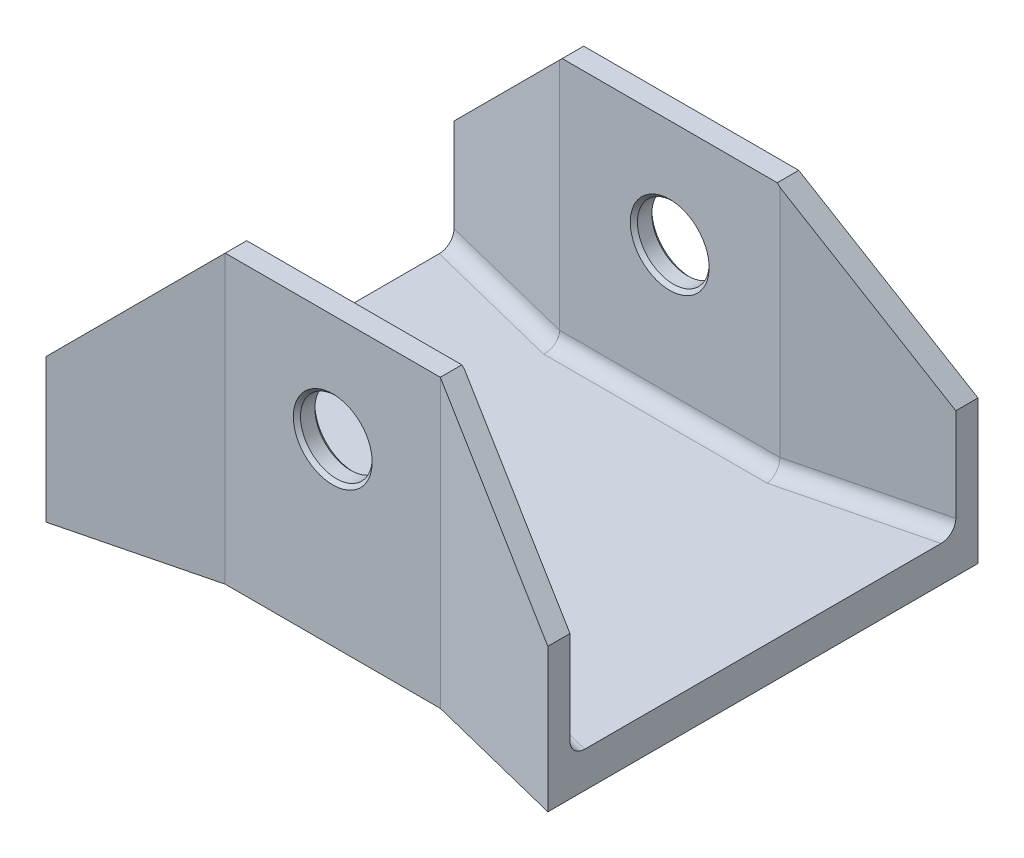
ISO-10303-21;
HEADER;
FILE_DESCRIPTION(('STEP AP214'),'2;1');
FILE_NAME('part.step','',(''),(''),'','','');
FILE_SCHEMA(('AUTOMOTIVE_DESIGN { 1 0 10303 214 1 1 1 1 }'));
ENDSEC;
DATA;
#1=APPLICATION_CONTEXT('core data for automotive mechanical design processes');
#2=APPLICATION_PROTOCOL_DEFINITION('international standard','automotive_design',2000,#1);
#3=PRODUCT_CONTEXT('',#1,'mechanical');
#4=PRODUCT('Part','Part','',(#3));
#5=PRODUCT_RELATED_PRODUCT_CATEGORY('part','',(#4));
#6=PRODUCT_DEFINITION_FORMATION('','',#4);
#7=PRODUCT_DEFINITION_CONTEXT('part definition',#1,'design');
#8=PRODUCT_DEFINITION('design','',#6,#7);
#9=PRODUCT_DEFINITION_SHAPE('','',#8);
#10=(LENGTH_UNIT() NAMED_UNIT(*) SI_UNIT(.MILLI.,.METRE.));
#11=(NAMED_UNIT(*) PLANE_ANGLE_UNIT() SI_UNIT($,.RADIAN.));
#12=(NAMED_UNIT(*) SI_UNIT($,.STERADIAN.) SOLID_ANGLE_UNIT());
#13=UNCERTAINTY_MEASURE_WITH_UNIT(LENGTH_MEASURE(1.E-05),#10,'distance_accuracy_value','');
#14=(GEOMETRIC_REPRESENTATION_CONTEXT(3) GLOBAL_UNCERTAINTY_ASSIGNED_CONTEXT((#13)) GLOBAL_UNIT_ASSIGNED_CONTEXT((#10,
#11,#12)) REPRESENTATION_CONTEXT('',''));
#15=CARTESIAN_POINT('',(0.,0.,0.));
#16=DIRECTION('',(0.,0.,1.));
#17=DIRECTION('',(1.,0.,0.));
#18=AXIS2_PLACEMENT_3D('',#15,#16,#17);
#19=CARTESIAN_POINT('',(0.,40.,0.));
#20=DIRECTION('',(0.,1.,0.));
#21=DIRECTION('',(0.,0.,1.));
#22=AXIS2_PLACEMENT_3D('',#19,#20,#21);
#23=PLANE('',#22);
#24=DIRECTION('',(1.,0.,0.));
#25=VECTOR('',#24,1.);
#26=CARTESIAN_POINT('',(-15.,40.,25.));
#27=LINE('',#26,#25);
#28=CARTESIAN_POINT('',(-15.,40.,25.));
#29=VERTEX_POINT('',#28);
#30=CARTESIAN_POINT('',(14.9999999999998,40.,25.));
#31=VERTEX_POINT('',#30);
#32=EDGE_CURVE('E216',#29,#31,#27,.T.);
#33=ORIENTED_EDGE('',*,*,#32,.T.);
#34=DIRECTION('',(0.,0.,-1.));
#35=VECTOR('',#34,1.);
#36=CARTESIAN_POINT('',(14.9999999999995,40.,26.907670780787));
#37=LINE('',#36,#35);
#38=CARTESIAN_POINT('',(14.9999999999995,40.,22.));
#39=VERTEX_POINT('',#38);
#40=EDGE_CURVE('E221',#31,#39,#37,.T.);
#41=ORIENTED_EDGE('',*,*,#40,.T.);
#42=DIRECTION('',(1.,0.,0.));
#43=VECTOR('',#42,1.);
#44=CARTESIAN_POINT('',(-15.369316876853,40.,22.));
#45=LINE('',#44,#43);
#46=CARTESIAN_POINT('',(-14.9999999999997,40.,22.));
#47=VERTEX_POINT('',#46);
#48=EDGE_CURVE('E219',#47,#39,#45,.T.);
#49=ORIENTED_EDGE('',*,*,#48,.F.);
#50=DIRECTION('',(0.,0.,1.));
#51=VECTOR('',#50,1.);
#52=CARTESIAN_POINT('',(-14.9999999999997,40.,30.));
#53=LINE('',#52,#51);
#54=EDGE_CURVE('E202',#47,#29,#53,.T.);
#55=ORIENTED_EDGE('',*,*,#54,.T.);
#56=EDGE_LOOP('',(#33,#41,#49,#55));
#57=FACE_BOUND('',#56,.T.);
#58=ADVANCED_FACE('F45',(#57),#23,.T.);
#59=CARTESIAN_POINT('',(-35.,40.,-30.));
#60=DIRECTION('',(-0.242535625036333,0.,0.970142500145332));
#61=DIRECTION('',(0.970142500145332,0.,0.242535625036333));
#62=AXIS2_PLACEMENT_3D('',#59,#60,#61);
#63=PLANE('',#62);
#64=DIRECTION('',(0.,-1.,0.));
#65=VECTOR('',#64,1.);
#66=CARTESIAN_POINT('',(-35.,40.,-30.));
#67=LINE('',#66,#65);
#68=CARTESIAN_POINT('',(-35.,19.9999999999999,-30.));
#69=VERTEX_POINT('',#68);
#70=CARTESIAN_POINT('',(-35.,0.,-30.));
#71=VERTEX_POINT('',#70);
#72=EDGE_CURVE('E293',#69,#71,#67,.T.);
#73=ORIENTED_EDGE('',*,*,#72,.F.);
#74=DIRECTION('',(0.696310623822795,0.696310623822788,0.174077655955698));
#75=VECTOR('',#74,1.);
#76=CARTESIAN_POINT('',(-11.9696969696966,43.030303030303,-24.2424242424242));
#77=LINE('',#76,#75);
#78=CARTESIAN_POINT('',(-15.,40.,-25.));
#79=VERTEX_POINT('',#78);
#80=EDGE_CURVE('E209',#69,#79,#77,.T.);
#81=ORIENTED_EDGE('',*,*,#80,.T.);
#82=DIRECTION('',(0.,-1.,0.));
#83=VECTOR('',#82,1.);
#84=CARTESIAN_POINT('',(-15.,40.,-25.));
#85=LINE('',#84,#83);
#86=CARTESIAN_POINT('',(-15.,0.,-25.));
#87=VERTEX_POINT('',#86);
#88=EDGE_CURVE('E245',#79,#87,#85,.T.);
#89=ORIENTED_EDGE('',*,*,#88,.T.);
#90=DIRECTION('',(-0.970142500145332,0.,-0.242535625036332));
#91=VECTOR('',#90,1.);
#92=CARTESIAN_POINT('',(-35.,0.,-30.));
#93=LINE('',#92,#91);
#94=EDGE_CURVE('E253',#87,#71,#93,.T.);
#95=ORIENTED_EDGE('',*,*,#94,.T.);
#96=EDGE_LOOP('',(#73,#81,#89,#95));
#97=FACE_BOUND('',#96,.T.);
#98=ADVANCED_FACE('F579',(#97),#63,.F.);
#99=CARTESIAN_POINT('',(-35.,40.,30.));
#100=DIRECTION('',(1.,0.,0.));
#101=DIRECTION('',(0.,0.,-1.));
#102=AXIS2_PLACEMENT_3D('',#99,#100,#101);
#103=PLANE('',#102);
#104=DIRECTION('',(0.,0.,1.));
#105=VECTOR('',#104,1.);
#106=CARTESIAN_POINT('',(-35.,5.,30.));
#107=LINE('',#106,#105);
#108=CARTESIAN_POINT('',(-35.,5.,-24.8461179679779));
#109=VERTEX_POINT('',#108);
#110=CARTESIAN_POINT('',(-35.,5.,24.8461179679779));
#111=VERTEX_POINT('',#110);
#112=EDGE_CURVE('E250',#109,#111,#107,.T.);
#113=ORIENTED_EDGE('',*,*,#112,.F.);
#114=CARTESIAN_POINT('',(-35.,7.,-24.8461179679779));
#115=DIRECTION('',(1.,0.,0.));
#116=DIRECTION('',(0.,0.,-1.));
#117=AXIS2_PLACEMENT_3D('',#114,#115,#116);
#118=ELLIPSE('',#117,2.06155281280883,2.);
#119=CARTESIAN_POINT('',(-35.,7.,-26.9076707807868));
#120=VERTEX_POINT('',#119);
#121=EDGE_CURVE('E62',#109,#120,#118,.T.);
#122=ORIENTED_EDGE('',*,*,#121,.T.);
#123=DIRECTION('',(0.,1.,0.));
#124=VECTOR('',#123,1.);
#125=CARTESIAN_POINT('',(-35.,40.,-26.9076707807868));
#126=LINE('',#125,#124);
#127=CARTESIAN_POINT('',(-35.,19.9999999999999,-26.9076707807868));
#128=VERTEX_POINT('',#127);
#129=EDGE_CURVE('E496',#120,#128,#126,.T.);
#130=ORIENTED_EDGE('',*,*,#129,.T.);
#131=DIRECTION('',(0.,0.,-1.));
#132=VECTOR('',#131,1.);
#133=CARTESIAN_POINT('',(-35.,19.9999999999999,-30.));
#134=LINE('',#133,#132);
#135=EDGE_CURVE('E349',#128,#69,#134,.T.);
#136=ORIENTED_EDGE('',*,*,#135,.T.);
#137=ORIENTED_EDGE('',*,*,#72,.T.);
#138=DIRECTION('',(0.,0.,1.));
#139=VECTOR('',#138,1.);
#140=CARTESIAN_POINT('',(-35.,0.,30.));
#141=LINE('',#140,#139);
#142=CARTESIAN_POINT('',(-35.,0.,30.));
#143=VERTEX_POINT('',#142);
#144=EDGE_CURVE('E257',#71,#143,#141,.T.);
#145=ORIENTED_EDGE('',*,*,#144,.T.);
#146=DIRECTION('',(0.,-1.,0.));
#147=VECTOR('',#146,1.);
#148=CARTESIAN_POINT('',(-35.,40.,30.));
#149=LINE('',#148,#147);
#150=CARTESIAN_POINT('',(-35.,19.9999999999999,30.));
#151=VERTEX_POINT('',#150);
#152=EDGE_CURVE('E232',#151,#143,#149,.T.);
#153=ORIENTED_EDGE('',*,*,#152,.F.);
#154=DIRECTION('',(0.,0.,-1.));
#155=VECTOR('',#154,1.);
#156=CARTESIAN_POINT('',(-35.,19.9999999999999,26.9076707807868));
#157=LINE('',#156,#155);
#158=CARTESIAN_POINT('',(-35.,19.9999999999999,26.9076707807868));
#159=VERTEX_POINT('',#158);
#160=EDGE_CURVE('E203',#151,#159,#157,.T.);
#161=ORIENTED_EDGE('',*,*,#160,.T.);
#162=DIRECTION('',(0.,-1.,0.));
#163=VECTOR('',#162,1.);
#164=CARTESIAN_POINT('',(-35.,40.,26.9076707807868));
#165=LINE('',#164,#163);
#166=CARTESIAN_POINT('',(-35.,7.,26.9076707807868));
#167=VERTEX_POINT('',#166);
#168=EDGE_CURVE('E491',#159,#167,#165,.T.);
#169=ORIENTED_EDGE('',*,*,#168,.T.);
#170=CARTESIAN_POINT('',(-35.,7.,24.8461179679779));
#171=DIRECTION('',(1.,0.,0.));
#172=DIRECTION('',(0.,0.,-1.));
#173=AXIS2_PLACEMENT_3D('',#170,#171,#172);
#174=ELLIPSE('',#173,2.06155281280883,2.);
#175=EDGE_CURVE('E394',#167,#111,#174,.T.);
#176=ORIENTED_EDGE('',*,*,#175,.T.);
#177=EDGE_LOOP('',(#113,#122,#130,#136,#137,#145,#153,#161,#169,#176));
#178=FACE_BOUND('',#177,.T.);
#179=ADVANCED_FACE('F492',(#178),#103,.F.);
#180=CARTESIAN_POINT('',(-35.,40.,30.));
#181=DIRECTION('',(-0.242535625036333,0.,-0.970142500145332));
#182=DIRECTION('',(-0.970142500145332,0.,0.242535625036333));
#183=AXIS2_PLACEMENT_3D('',#180,#181,#182);
#184=PLANE('',#183);
#185=DIRECTION('',(0.,-1.,0.));
#186=VECTOR('',#185,1.);
#187=CARTESIAN_POINT('',(-15.,40.,25.));
#188=LINE('',#187,#186);
#189=CARTESIAN_POINT('',(-15.,0.,25.));
#190=VERTEX_POINT('',#189);
#191=EDGE_CURVE('E225',#29,#190,#188,.T.);
#192=ORIENTED_EDGE('',*,*,#191,.F.);
#193=DIRECTION('',(-0.696310623822795,-0.696310623822788,0.174077655955698));
#194=VECTOR('',#193,1.);
#195=CARTESIAN_POINT('',(-11.9696969696966,43.030303030303,24.2424242424242));
#196=LINE('',#195,#194);
#197=EDGE_CURVE('E197',#29,#151,#196,.T.);
#198=ORIENTED_EDGE('',*,*,#197,.T.);
#199=ORIENTED_EDGE('',*,*,#152,.T.);
#200=DIRECTION('',(0.970142500145332,0.,-0.242535625036332));
#201=VECTOR('',#200,1.);
#202=CARTESIAN_POINT('',(-35.,0.,30.));
#203=LINE('',#202,#201);
#204=EDGE_CURVE('E228',#143,#190,#203,.T.);
#205=ORIENTED_EDGE('',*,*,#204,.T.);
#206=EDGE_LOOP('',(#192,#198,#199,#205));
#207=FACE_BOUND('',#206,.T.);
#208=ADVANCED_FACE('F226',(#207),#184,.F.);
#209=CARTESIAN_POINT('',(-15.,40.,25.));
#210=DIRECTION('',(0.,0.,-1.));
#211=DIRECTION('',(-1.,0.,0.));
#212=AXIS2_PLACEMENT_3D('',#209,#210,#211);
#213=PLANE('',#212);
#214=CARTESIAN_POINT('',(0.,25.,25.));
#215=DIRECTION('',(0.,0.,-1.));
#216=DIRECTION('',(-1.,0.,0.));
#217=AXIS2_PLACEMENT_3D('',#214,#215,#216);
#218=CIRCLE('',#217,5.50000000000002);
#219=CARTESIAN_POINT('',(-5.50000000000002,25.,25.));
#220=VERTEX_POINT('',#219);
#221=EDGE_CURVE('E11',#220,#220,#218,.T.);
#222=ORIENTED_EDGE('',*,*,#221,.T.);
#223=EDGE_LOOP('',(#222));
#224=FACE_BOUND('',#223,.T.);
#225=DIRECTION('',(1.,0.,0.));
#226=VECTOR('',#225,1.);
#227=CARTESIAN_POINT('',(-15.,0.,25.));
#228=LINE('',#227,#226);
#229=CARTESIAN_POINT('',(14.9999999999998,0.,25.));
#230=VERTEX_POINT('',#229);
#231=EDGE_CURVE('E263',#190,#230,#228,.T.);
#232=ORIENTED_EDGE('',*,*,#231,.T.);
#233=DIRECTION('',(0.,-1.,0.));
#234=VECTOR('',#233,1.);
#235=CARTESIAN_POINT('',(14.9999999999998,40.,25.));
#236=LINE('',#235,#234);
#237=EDGE_CURVE('E233',#31,#230,#236,.T.);
#238=ORIENTED_EDGE('',*,*,#237,.F.);
#239=ORIENTED_EDGE('',*,*,#32,.F.);
#240=ORIENTED_EDGE('',*,*,#191,.T.);
#241=EDGE_LOOP('',(#232,#238,#239,#240));
#242=FACE_BOUND('',#241,.T.);
#243=ADVANCED_FACE('F235',(#224,#242),#213,.F.);
#244=CARTESIAN_POINT('',(34.9999999999998,40.,30.0000000000002));
#245=DIRECTION('',(0.242535625036343,0.,-0.970142500145329));
#246=DIRECTION('',(-0.97014250014533,0.,-0.242535625036343));
#247=AXIS2_PLACEMENT_3D('',#244,#245,#246);
#248=PLANE('',#247);
#249=DIRECTION('',(0.,-1.,0.));
#250=VECTOR('',#249,1.);
#251=CARTESIAN_POINT('',(34.9999999999998,40.,30.0000000000002));
#252=LINE('',#251,#250);
#253=CARTESIAN_POINT('',(34.9999999999998,19.9999999999999,30.0000000000002));
#254=VERTEX_POINT('',#253);
#255=CARTESIAN_POINT('',(34.9999999999998,0.,30.0000000000002));
#256=VERTEX_POINT('',#255);
#257=EDGE_CURVE('E286',#254,#256,#252,.T.);
#258=ORIENTED_EDGE('',*,*,#257,.F.);
#259=DIRECTION('',(-0.696310623822794,0.696310623822787,-0.174077655955706));
#260=VECTOR('',#259,1.);
#261=CARTESIAN_POINT('',(11.9696969696963,43.0303030303031,24.2424242424241));
#262=LINE('',#261,#260);
#263=EDGE_CURVE('E318',#254,#31,#262,.T.);
#264=ORIENTED_EDGE('',*,*,#263,.T.);
#265=ORIENTED_EDGE('',*,*,#237,.T.);
#266=DIRECTION('',(0.970142500145329,0.,0.242535625036343));
#267=VECTOR('',#266,1.);
#268=CARTESIAN_POINT('',(34.9999999999998,0.,30.0000000000002));
#269=LINE('',#268,#267);
#270=EDGE_CURVE('E266',#230,#256,#269,.T.);
#271=ORIENTED_EDGE('',*,*,#270,.T.);
#272=EDGE_LOOP('',(#258,#264,#265,#271));
#273=FACE_BOUND('',#272,.T.);
#274=ADVANCED_FACE('F543',(#273),#248,.F.);
#275=CARTESIAN_POINT('',(34.9999999999998,40.,30.0000000000002));
#276=DIRECTION('',(-1.,0.,0.));
#277=DIRECTION('',(0.,0.,1.));
#278=AXIS2_PLACEMENT_3D('',#275,#276,#277);
#279=PLANE('',#278);
#280=DIRECTION('',(0.,0.,-1.));
#281=VECTOR('',#280,1.);
#282=CARTESIAN_POINT('',(34.9999999999998,5.,30.0000000000002));
#283=LINE('',#282,#281);
#284=CARTESIAN_POINT('',(34.9999999999998,5.,24.8461179679781));
#285=VERTEX_POINT('',#284);
#286=CARTESIAN_POINT('',(34.9999999999998,5.,-24.8461179679781));
#287=VERTEX_POINT('',#286);
#288=EDGE_CURVE('E222',#285,#287,#283,.T.);
#289=ORIENTED_EDGE('',*,*,#288,.F.);
#290=CARTESIAN_POINT('',(34.9999999999998,7.,24.8461179679781));
#291=DIRECTION('',(-1.,0.,0.));
#292=DIRECTION('',(0.,0.,1.));
#293=AXIS2_PLACEMENT_3D('',#290,#291,#292);
#294=ELLIPSE('',#293,2.06155281280884,2.);
#295=CARTESIAN_POINT('',(34.9999999999998,7.,26.907670780787));
#296=VERTEX_POINT('',#295);
#297=EDGE_CURVE('E397',#285,#296,#294,.T.);
#298=ORIENTED_EDGE('',*,*,#297,.T.);
#299=DIRECTION('',(0.,1.,0.));
#300=VECTOR('',#299,1.);
#301=CARTESIAN_POINT('',(34.9999999999998,40.,26.907670780787));
#302=LINE('',#301,#300);
#303=CARTESIAN_POINT('',(34.9999999999998,19.9999999999999,26.907670780787));
#304=VERTEX_POINT('',#303);
#305=EDGE_CURVE('E495',#296,#304,#302,.T.);
#306=ORIENTED_EDGE('',*,*,#305,.T.);
#307=DIRECTION('',(0.,0.,1.));
#308=VECTOR('',#307,1.);
#309=CARTESIAN_POINT('',(34.9999999999998,19.9999999999999,30.0000000000002));
#310=LINE('',#309,#308);
#311=EDGE_CURVE('E315',#304,#254,#310,.T.);
#312=ORIENTED_EDGE('',*,*,#311,.T.);
#313=ORIENTED_EDGE('',*,*,#257,.T.);
#314=DIRECTION('',(0.,0.,-1.));
#315=VECTOR('',#314,1.);
#316=CARTESIAN_POINT('',(34.9999999999998,0.,30.0000000000002));
#317=LINE('',#316,#315);
#318=CARTESIAN_POINT('',(34.9999999999998,0.,-30.0000000000002));
#319=VERTEX_POINT('',#318);
#320=EDGE_CURVE('E270',#256,#319,#317,.T.);
#321=ORIENTED_EDGE('',*,*,#320,.T.);
#322=DIRECTION('',(0.,-1.,0.));
#323=VECTOR('',#322,1.);
#324=CARTESIAN_POINT('',(34.9999999999998,40.,-30.0000000000002));
#325=LINE('',#324,#323);
#326=CARTESIAN_POINT('',(34.9999999999998,19.9999999999999,-30.0000000000002));
#327=VERTEX_POINT('',#326);
#328=EDGE_CURVE('E283',#327,#319,#325,.T.);
#329=ORIENTED_EDGE('',*,*,#328,.F.);
#330=DIRECTION('',(0.,0.,1.));
#331=VECTOR('',#330,1.);
#332=CARTESIAN_POINT('',(34.9999999999998,19.9999999999999,-26.907670780787));
#333=LINE('',#332,#331);
#334=CARTESIAN_POINT('',(34.9999999999998,19.9999999999999,-26.907670780787));
#335=VERTEX_POINT('',#334);
#336=EDGE_CURVE('E312',#327,#335,#333,.T.);
#337=ORIENTED_EDGE('',*,*,#336,.T.);
#338=DIRECTION('',(0.,-1.,0.));
#339=VECTOR('',#338,1.);
#340=CARTESIAN_POINT('',(34.9999999999998,40.,-26.907670780787));
#341=LINE('',#340,#339);
#342=CARTESIAN_POINT('',(34.9999999999998,7.,-26.907670780787));
#343=VERTEX_POINT('',#342);
#344=EDGE_CURVE('E500',#335,#343,#341,.T.);
#345=ORIENTED_EDGE('',*,*,#344,.T.);
#346=CARTESIAN_POINT('',(34.9999999999998,7.,-24.8461179679781));
#347=DIRECTION('',(-1.,0.,0.));
#348=DIRECTION('',(0.,0.,1.));
#349=AXIS2_PLACEMENT_3D('',#346,#347,#348);
#350=ELLIPSE('',#349,2.06155281280884,2.);
#351=EDGE_CURVE('E400',#343,#287,#350,.T.);
#352=ORIENTED_EDGE('',*,*,#351,.T.);
#353=EDGE_LOOP('',(#289,#298,#306,#312,#313,#321,#329,#337,#345,#352));
#354=FACE_BOUND('',#353,.T.);
#355=ADVANCED_FACE('F535',(#354),#279,.F.);
#356=CARTESIAN_POINT('',(34.9999999999998,40.,-30.0000000000002));
#357=DIRECTION('',(0.242535625036343,0.,0.970142500145329));
#358=DIRECTION('',(0.97014250014533,0.,-0.242535625036343));
#359=AXIS2_PLACEMENT_3D('',#356,#357,#358);
#360=PLANE('',#359);
#361=DIRECTION('',(0.,-1.,0.));
#362=VECTOR('',#361,1.);
#363=CARTESIAN_POINT('',(14.9999999999998,40.,-25.));
#364=LINE('',#363,#362);
#365=CARTESIAN_POINT('',(14.9999999999998,40.,-25.));
#366=VERTEX_POINT('',#365);
#367=CARTESIAN_POINT('',(14.9999999999998,0.,-25.));
#368=VERTEX_POINT('',#367);
#369=EDGE_CURVE('E279',#366,#368,#364,.T.);
#370=ORIENTED_EDGE('',*,*,#369,.F.);
#371=DIRECTION('',(0.696310623822794,-0.696310623822787,-0.174077655955706));
#372=VECTOR('',#371,1.);
#373=CARTESIAN_POINT('',(11.9696969696963,43.0303030303031,-24.2424242424241));
#374=LINE('',#373,#372);
#375=EDGE_CURVE('E329',#366,#327,#374,.T.);
#376=ORIENTED_EDGE('',*,*,#375,.T.);
#377=ORIENTED_EDGE('',*,*,#328,.T.);
#378=DIRECTION('',(-0.970142500145329,0.,0.242535625036343));
#379=VECTOR('',#378,1.);
#380=CARTESIAN_POINT('',(34.9999999999998,0.,-30.0000000000002));
#381=LINE('',#380,#379);
#382=EDGE_CURVE('E247',#319,#368,#381,.T.);
#383=ORIENTED_EDGE('',*,*,#382,.T.);
#384=EDGE_LOOP('',(#370,#376,#377,#383));
#385=FACE_BOUND('',#384,.T.);
#386=ADVANCED_FACE('F584',(#385),#360,.F.);
#387=CARTESIAN_POINT('',(-15.,40.,-25.));
#388=DIRECTION('',(0.,0.,1.));
#389=DIRECTION('',(1.,0.,0.));
#390=AXIS2_PLACEMENT_3D('',#387,#388,#389);
#391=PLANE('',#390);
#392=CARTESIAN_POINT('',(0.,25.,-25.));
#393=DIRECTION('',(0.,0.,1.));
#394=DIRECTION('',(1.,0.,0.));
#395=AXIS2_PLACEMENT_3D('',#392,#393,#394);
#396=CIRCLE('',#395,5.50000000000001);
#397=CARTESIAN_POINT('',(5.50000000000001,25.,-25.));
#398=VERTEX_POINT('',#397);
#399=EDGE_CURVE('E432',#398,#398,#396,.T.);
#400=ORIENTED_EDGE('',*,*,#399,.T.);
#401=EDGE_LOOP('',(#400));
#402=FACE_BOUND('',#401,.T.);
#403=DIRECTION('',(-1.,0.,0.));
#404=VECTOR('',#403,1.);
#405=CARTESIAN_POINT('',(-15.,0.,-25.));
#406=LINE('',#405,#404);
#407=EDGE_CURVE('E240',#368,#87,#406,.T.);
#408=ORIENTED_EDGE('',*,*,#407,.T.);
#409=ORIENTED_EDGE('',*,*,#88,.F.);
#410=DIRECTION('',(-1.,0.,0.));
#411=VECTOR('',#410,1.);
#412=CARTESIAN_POINT('',(-15.,40.,-25.));
#413=LINE('',#412,#411);
#414=EDGE_CURVE('E239',#366,#79,#413,.T.);
#415=ORIENTED_EDGE('',*,*,#414,.F.);
#416=ORIENTED_EDGE('',*,*,#369,.T.);
#417=EDGE_LOOP('',(#408,#409,#415,#416));
#418=FACE_BOUND('',#417,.T.);
#419=ADVANCED_FACE('F582',(#402,#418),#391,.F.);
#420=DIRECTION('',(-1.,0.,0.));
#421=VECTOR('',#420,1.);
#422=CARTESIAN_POINT('',(15.3693168768528,40.,-22.));
#423=LINE('',#422,#421);
#424=CARTESIAN_POINT('',(14.9999999999995,40.,-22.));
#425=VERTEX_POINT('',#424);
#426=CARTESIAN_POINT('',(-14.9999999999997,40.,-22.));
#427=VERTEX_POINT('',#426);
#428=EDGE_CURVE('E414',#425,#427,#423,.T.);
#429=ORIENTED_EDGE('',*,*,#428,.F.);
#430=DIRECTION('',(0.,0.,-1.));
#431=VECTOR('',#430,1.);
#432=CARTESIAN_POINT('',(14.9999999999995,40.,-30.0000000000002));
#433=LINE('',#432,#431);
#434=EDGE_CURVE('E325',#425,#366,#433,.T.);
#435=ORIENTED_EDGE('',*,*,#434,.T.);
#436=ORIENTED_EDGE('',*,*,#414,.T.);
#437=DIRECTION('',(0.,0.,1.));
#438=VECTOR('',#437,1.);
#439=CARTESIAN_POINT('',(-14.9999999999997,40.,-26.9076707807868));
#440=LINE('',#439,#438);
#441=EDGE_CURVE('E321',#79,#427,#440,.T.);
#442=ORIENTED_EDGE('',*,*,#441,.T.);
#443=EDGE_LOOP('',(#429,#435,#436,#442));
#444=FACE_BOUND('',#443,.T.);
#445=ADVANCED_FACE('F560',(#444),#23,.T.);
#446=CARTESIAN_POINT('',(0.,0.,0.));
#447=DIRECTION('',(0.,1.,0.));
#448=DIRECTION('',(0.,0.,1.));
#449=AXIS2_PLACEMENT_3D('',#446,#447,#448);
#450=PLANE('',#449);
#451=ORIENTED_EDGE('',*,*,#94,.F.);
#452=ORIENTED_EDGE('',*,*,#407,.F.);
#453=ORIENTED_EDGE('',*,*,#382,.F.);
#454=ORIENTED_EDGE('',*,*,#320,.F.);
#455=ORIENTED_EDGE('',*,*,#270,.F.);
#456=ORIENTED_EDGE('',*,*,#231,.F.);
#457=ORIENTED_EDGE('',*,*,#204,.F.);
#458=ORIENTED_EDGE('',*,*,#144,.F.);
#459=EDGE_LOOP('',(#451,#452,#453,#454,#455,#456,#457,#458));
#460=FACE_BOUND('',#459,.T.);
#461=ADVANCED_FACE('F549',(#460),#450,.F.);
#462=CARTESIAN_POINT('',(0.,5.,0.));
#463=DIRECTION('',(0.,1.,0.));
#464=DIRECTION('',(0.,0.,1.));
#465=AXIS2_PLACEMENT_3D('',#462,#463,#464);
#466=PLANE('',#465);
#467=ORIENTED_EDGE('',*,*,#112,.T.);
#468=DIRECTION('',(0.970142500145332,0.,-0.242535625036333));
#469=VECTOR('',#468,1.);
#470=CARTESIAN_POINT('',(3.78732187481833,5.,15.1492874992733));
#471=LINE('',#470,#469);
#472=CARTESIAN_POINT('',(-15.6155281280883,5.,20.));
#473=VERTEX_POINT('',#472);
#474=EDGE_CURVE('E373',#111,#473,#471,.T.);
#475=ORIENTED_EDGE('',*,*,#474,.T.);
#476=DIRECTION('',(1.,0.,0.));
#477=VECTOR('',#476,1.);
#478=CARTESIAN_POINT('',(0.,5.,20.));
#479=LINE('',#478,#477);
#480=CARTESIAN_POINT('',(15.6155281280882,5.,20.));
#481=VERTEX_POINT('',#480);
#482=EDGE_CURVE('E370',#473,#481,#479,.T.);
#483=ORIENTED_EDGE('',*,*,#482,.T.);
#484=DIRECTION('',(0.970142500145329,0.,0.242535625036343));
#485=VECTOR('',#484,1.);
#486=CARTESIAN_POINT('',(-3.78732187481845,5.,15.1492874992731));
#487=LINE('',#486,#485);
#488=EDGE_CURVE('E367',#481,#285,#487,.T.);
#489=ORIENTED_EDGE('',*,*,#488,.T.);
#490=ORIENTED_EDGE('',*,*,#288,.T.);
#491=DIRECTION('',(-0.970142500145329,0.,0.242535625036343));
#492=VECTOR('',#491,1.);
#493=CARTESIAN_POINT('',(-3.78732187481845,5.,-15.1492874992731));
#494=LINE('',#493,#492);
#495=CARTESIAN_POINT('',(15.6155281280882,5.,-20.));
#496=VERTEX_POINT('',#495);
#497=EDGE_CURVE('E363',#287,#496,#494,.T.);
#498=ORIENTED_EDGE('',*,*,#497,.T.);
#499=DIRECTION('',(-1.,0.,0.));
#500=VECTOR('',#499,1.);
#501=CARTESIAN_POINT('',(0.,5.,-20.));
#502=LINE('',#501,#500);
#503=CARTESIAN_POINT('',(-15.6155281280883,5.,-20.));
#504=VERTEX_POINT('',#503);
#505=EDGE_CURVE('E360',#496,#504,#502,.T.);
#506=ORIENTED_EDGE('',*,*,#505,.T.);
#507=DIRECTION('',(-0.970142500145332,0.,-0.242535625036332));
#508=VECTOR('',#507,1.);
#509=CARTESIAN_POINT('',(3.78732187481833,5.,-15.1492874992734));
#510=LINE('',#509,#508);
#511=EDGE_CURVE('E357',#504,#109,#510,.T.);
#512=ORIENTED_EDGE('',*,*,#511,.T.);
#513=EDGE_LOOP('',(#467,#475,#483,#489,#490,#498,#506,#512));
#514=FACE_BOUND('',#513,.T.);
#515=ADVANCED_FACE('F511',(#514),#466,.T.);
#516=CARTESIAN_POINT('',(46.2965019072623,5.,-29.7317962576027));
#517=DIRECTION('',(-0.242535625036343,0.,-0.970142500145329));
#518=DIRECTION('',(-0.970142500145329,0.,0.242535625036343));
#519=AXIS2_PLACEMENT_3D('',#516,#517,#518);
#520=PLANE('',#519);
#521=DIRECTION('',(0.,1.,0.));
#522=VECTOR('',#521,1.);
#523=CARTESIAN_POINT('',(15.3693168768528,5.,-22.));
#524=LINE('',#523,#522);
#525=CARTESIAN_POINT('',(15.3693168768528,7.,-22.));
#526=VERTEX_POINT('',#525);
#527=CARTESIAN_POINT('',(15.3693168768528,39.6306831231466,-22.));
#528=VERTEX_POINT('',#527);
#529=EDGE_CURVE('E470',#526,#528,#524,.T.);
#530=ORIENTED_EDGE('',*,*,#529,.F.);
#531=DIRECTION('',(-0.970142500145329,0.,0.242535625036343));
#532=VECTOR('',#531,1.);
#533=CARTESIAN_POINT('',(46.2965019072623,7.,-29.7317962576027));
#534=LINE('',#533,#532);
#535=EDGE_CURVE('E386',#526,#343,#534,.F.);
#536=ORIENTED_EDGE('',*,*,#535,.T.);
#537=ORIENTED_EDGE('',*,*,#344,.F.);
#538=DIRECTION('',(-0.696310623822794,0.696310623822787,0.174077655955706));
#539=VECTOR('',#538,1.);
#540=CARTESIAN_POINT('',(12.3445247538434,42.6554752461561,-21.2438019692476));
#541=LINE('',#540,#539);
#542=EDGE_CURVE('E332',#335,#528,#541,.T.);
#543=ORIENTED_EDGE('',*,*,#542,.T.);
#544=EDGE_LOOP('',(#530,#536,#537,#543));
#545=FACE_BOUND('',#544,.T.);
#546=ADVANCED_FACE('F526',(#545),#520,.F.);
#547=CARTESIAN_POINT('',(15.3693168768528,5.,22.));
#548=DIRECTION('',(-0.242535625036343,0.,0.970142500145329));
#549=DIRECTION('',(0.970142500145329,0.,0.242535625036343));
#550=AXIS2_PLACEMENT_3D('',#547,#548,#549);
#551=PLANE('',#550);
#552=ORIENTED_EDGE('',*,*,#305,.F.);
#553=DIRECTION('',(0.970142500145329,0.,0.242535625036343));
#554=VECTOR('',#553,1.);
#555=CARTESIAN_POINT('',(15.3693168768528,7.,22.));
#556=LINE('',#555,#554);
#557=CARTESIAN_POINT('',(15.3693168768528,7.,22.));
#558=VERTEX_POINT('',#557);
#559=EDGE_CURVE('E383',#296,#558,#556,.F.);
#560=ORIENTED_EDGE('',*,*,#559,.T.);
#561=DIRECTION('',(0.,1.,0.));
#562=VECTOR('',#561,1.);
#563=CARTESIAN_POINT('',(15.3693168768528,5.,22.));
#564=LINE('',#563,#562);
#565=CARTESIAN_POINT('',(15.3693168768528,39.6306831231466,22.));
#566=VERTEX_POINT('',#565);
#567=EDGE_CURVE('E463',#558,#566,#564,.T.);
#568=ORIENTED_EDGE('',*,*,#567,.T.);
#569=DIRECTION('',(0.696310623822794,-0.696310623822787,0.174077655955706));
#570=VECTOR('',#569,1.);
#571=CARTESIAN_POINT('',(12.3445247538434,42.6554752461561,21.2438019692476));
#572=LINE('',#571,#570);
#573=EDGE_CURVE('E308',#566,#304,#572,.T.);
#574=ORIENTED_EDGE('',*,*,#573,.T.);
#575=EDGE_LOOP('',(#552,#560,#568,#574));
#576=FACE_BOUND('',#575,.T.);
#577=ADVANCED_FACE('F537',(#576),#551,.F.);
#578=CARTESIAN_POINT('',(-49.9225723631085,5.,30.6383138715639));
#579=DIRECTION('',(0.242535625036333,0.,0.970142500145332));
#580=DIRECTION('',(0.970142500145332,0.,-0.242535625036333));
#581=AXIS2_PLACEMENT_3D('',#578,#579,#580);
#582=PLANE('',#581);
#583=DIRECTION('',(0.,1.,0.));
#584=VECTOR('',#583,1.);
#585=CARTESIAN_POINT('',(-15.369316876853,5.,22.));
#586=LINE('',#585,#584);
#587=CARTESIAN_POINT('',(-15.369316876853,7.,22.));
#588=VERTEX_POINT('',#587);
#589=CARTESIAN_POINT('',(-15.369316876853,39.6306831231467,22.));
#590=VERTEX_POINT('',#589);
#591=EDGE_CURVE('E471',#588,#590,#586,.T.);
#592=ORIENTED_EDGE('',*,*,#591,.F.);
#593=DIRECTION('',(0.970142500145332,0.,-0.242535625036333));
#594=VECTOR('',#593,1.);
#595=CARTESIAN_POINT('',(-49.9225723631085,7.,30.6383138715639));
#596=LINE('',#595,#594);
#597=EDGE_CURVE('E377',#588,#167,#596,.F.);
#598=ORIENTED_EDGE('',*,*,#597,.T.);
#599=ORIENTED_EDGE('',*,*,#168,.F.);
#600=DIRECTION('',(0.696310623822795,0.696310623822788,-0.174077655955698));
#601=VECTOR('',#600,1.);
#602=CARTESIAN_POINT('',(-12.3445247538437,42.655475246156,21.2438019692477));
#603=LINE('',#602,#601);
#604=EDGE_CURVE('E208',#159,#590,#603,.T.);
#605=ORIENTED_EDGE('',*,*,#604,.T.);
#606=EDGE_LOOP('',(#592,#598,#599,#605));
#607=FACE_BOUND('',#606,.T.);
#608=ADVANCED_FACE('F490',(#607),#582,.F.);
#609=CARTESIAN_POINT('',(-15.369316876853,5.,-22.));
#610=DIRECTION('',(0.242535625036332,0.,-0.970142500145332));
#611=DIRECTION('',(-0.970142500145332,0.,-0.242535625036332));
#612=AXIS2_PLACEMENT_3D('',#609,#610,#611);
#613=PLANE('',#612);
#614=ORIENTED_EDGE('',*,*,#129,.F.);
#615=DIRECTION('',(-0.970142500145332,0.,-0.242535625036332));
#616=VECTOR('',#615,1.);
#617=CARTESIAN_POINT('',(-15.369316876853,7.,-22.));
#618=LINE('',#617,#616);
#619=CARTESIAN_POINT('',(-15.369316876853,7.,-22.));
#620=VERTEX_POINT('',#619);
#621=EDGE_CURVE('E69',#120,#620,#618,.F.);
#622=ORIENTED_EDGE('',*,*,#621,.T.);
#623=DIRECTION('',(0.,1.,0.));
#624=VECTOR('',#623,1.);
#625=CARTESIAN_POINT('',(-15.369316876853,5.,-22.));
#626=LINE('',#625,#624);
#627=CARTESIAN_POINT('',(-15.369316876853,39.6306831231467,-22.));
#628=VERTEX_POINT('',#627);
#629=EDGE_CURVE('E523',#620,#628,#626,.T.);
#630=ORIENTED_EDGE('',*,*,#629,.T.);
#631=DIRECTION('',(-0.696310623822795,-0.696310623822788,-0.174077655955698));
#632=VECTOR('',#631,1.);
#633=CARTESIAN_POINT('',(-12.3445247538437,42.655475246156,-21.2438019692477));
#634=LINE('',#633,#632);
#635=EDGE_CURVE('E343',#628,#128,#634,.T.);
#636=ORIENTED_EDGE('',*,*,#635,.T.);
#637=EDGE_LOOP('',(#614,#622,#630,#636));
#638=FACE_BOUND('',#637,.T.);
#639=ADVANCED_FACE('F570',(#638),#613,.F.);
#640=CARTESIAN_POINT('',(15.3693168768528,5.,-22.));
#641=DIRECTION('',(0.,0.,-1.));
#642=DIRECTION('',(-1.,0.,0.));
#643=AXIS2_PLACEMENT_3D('',#640,#641,#642);
#644=PLANE('',#643);
#645=CARTESIAN_POINT('',(0.,25.,-22.));
#646=DIRECTION('',(0.,0.,-1.));
#647=DIRECTION('',(-1.,0.,0.));
#648=AXIS2_PLACEMENT_3D('',#645,#646,#647);
#649=CIRCLE('',#648,5.50000000000002);
#650=CARTESIAN_POINT('',(-5.50000000000002,25.,-22.));
#651=VERTEX_POINT('',#650);
#652=EDGE_CURVE('E405',#651,#651,#649,.T.);
#653=ORIENTED_EDGE('',*,*,#652,.T.);
#654=EDGE_LOOP('',(#653));
#655=FACE_BOUND('',#654,.T.);
#656=ORIENTED_EDGE('',*,*,#629,.F.);
#657=DIRECTION('',(-1.,0.,0.));
#658=VECTOR('',#657,1.);
#659=CARTESIAN_POINT('',(15.3693168768528,7.,-22.));
#660=LINE('',#659,#658);
#661=EDGE_CURVE('E389',#620,#526,#660,.F.);
#662=ORIENTED_EDGE('',*,*,#661,.T.);
#663=ORIENTED_EDGE('',*,*,#529,.T.);
#664=DIRECTION('',(-0.707106781186551,0.707106781186544,0.));
#665=VECTOR('',#664,1.);
#666=CARTESIAN_POINT('',(14.9999999999995,40.,-22.));
#667=LINE('',#666,#665);
#668=EDGE_CURVE('E340',#528,#425,#667,.T.);
#669=ORIENTED_EDGE('',*,*,#668,.T.);
#670=ORIENTED_EDGE('',*,*,#428,.T.);
#671=DIRECTION('',(-0.707106781186551,-0.707106781186544,0.));
#672=VECTOR('',#671,1.);
#673=CARTESIAN_POINT('',(-14.9999999999997,40.,-22.));
#674=LINE('',#673,#672);
#675=EDGE_CURVE('E336',#427,#628,#674,.T.);
#676=ORIENTED_EDGE('',*,*,#675,.T.);
#677=EDGE_LOOP('',(#656,#662,#663,#669,#670,#676));
#678=FACE_BOUND('',#677,.T.);
#679=ADVANCED_FACE('F460',(#655,#678),#644,.F.);
#680=CARTESIAN_POINT('',(-15.369316876853,5.,22.));
#681=DIRECTION('',(0.,0.,1.));
#682=DIRECTION('',(1.,0.,0.));
#683=AXIS2_PLACEMENT_3D('',#680,#681,#682);
#684=PLANE('',#683);
#685=CARTESIAN_POINT('',(0.,25.,22.));
#686=DIRECTION('',(0.,0.,1.));
#687=DIRECTION('',(1.,0.,0.));
#688=AXIS2_PLACEMENT_3D('',#685,#686,#687);
#689=CIRCLE('',#688,5.50000000000001);
#690=CARTESIAN_POINT('',(5.50000000000001,25.,22.));
#691=VERTEX_POINT('',#690);
#692=EDGE_CURVE('E436',#691,#691,#689,.T.);
#693=ORIENTED_EDGE('',*,*,#692,.T.);
#694=EDGE_LOOP('',(#693));
#695=FACE_BOUND('',#694,.T.);
#696=ORIENTED_EDGE('',*,*,#567,.F.);
#697=DIRECTION('',(1.,0.,0.));
#698=VECTOR('',#697,1.);
#699=CARTESIAN_POINT('',(-15.369316876853,7.,22.));
#700=LINE('',#699,#698);
#701=EDGE_CURVE('E380',#558,#588,#700,.F.);
#702=ORIENTED_EDGE('',*,*,#701,.T.);
#703=ORIENTED_EDGE('',*,*,#591,.T.);
#704=DIRECTION('',(0.707106781186551,0.707106781186544,0.));
#705=VECTOR('',#704,1.);
#706=CARTESIAN_POINT('',(-14.9999999999997,40.,22.));
#707=LINE('',#706,#705);
#708=EDGE_CURVE('E301',#590,#47,#707,.T.);
#709=ORIENTED_EDGE('',*,*,#708,.T.);
#710=ORIENTED_EDGE('',*,*,#48,.T.);
#711=DIRECTION('',(0.707106781186551,-0.707106781186544,0.));
#712=VECTOR('',#711,1.);
#713=CARTESIAN_POINT('',(14.9999999999995,40.,22.));
#714=LINE('',#713,#712);
#715=EDGE_CURVE('E304',#39,#566,#714,.T.);
#716=ORIENTED_EDGE('',*,*,#715,.T.);
#717=EDGE_LOOP('',(#696,#702,#703,#709,#710,#716));
#718=FACE_BOUND('',#717,.T.);
#719=ADVANCED_FACE('F456',(#695,#718),#684,.F.);
#720=CARTESIAN_POINT('',(14.9999999999995,40.,0.));
#721=DIRECTION('',(0.707106781186544,0.707106781186551,0.));
#722=DIRECTION('',(0.,0.,1.));
#723=AXIS2_PLACEMENT_3D('',#720,#721,#722);
#724=PLANE('',#723);
#725=ORIENTED_EDGE('',*,*,#263,.F.);
#726=ORIENTED_EDGE('',*,*,#311,.F.);
#727=ORIENTED_EDGE('',*,*,#573,.F.);
#728=ORIENTED_EDGE('',*,*,#715,.F.);
#729=ORIENTED_EDGE('',*,*,#40,.F.);
#730=EDGE_LOOP('',(#725,#726,#727,#728,#729));
#731=FACE_BOUND('',#730,.T.);
#732=ADVANCED_FACE('F459',(#731),#724,.T.);
#733=CARTESIAN_POINT('',(14.9999999999995,40.,0.));
#734=DIRECTION('',(0.707106781186544,0.707106781186551,0.));
#735=DIRECTION('',(0.,0.,1.));
#736=AXIS2_PLACEMENT_3D('',#733,#734,#735);
#737=PLANE('',#736);
#738=ORIENTED_EDGE('',*,*,#542,.F.);
#739=ORIENTED_EDGE('',*,*,#336,.F.);
#740=ORIENTED_EDGE('',*,*,#375,.F.);
#741=ORIENTED_EDGE('',*,*,#434,.F.);
#742=ORIENTED_EDGE('',*,*,#668,.F.);
#743=EDGE_LOOP('',(#738,#739,#740,#741,#742));
#744=FACE_BOUND('',#743,.T.);
#745=ADVANCED_FACE('F555',(#744),#737,.T.);
#746=CARTESIAN_POINT('',(-14.9999999999997,40.,0.));
#747=DIRECTION('',(-0.707106781186544,0.707106781186551,0.));
#748=DIRECTION('',(0.,0.,-1.));
#749=AXIS2_PLACEMENT_3D('',#746,#747,#748);
#750=PLANE('',#749);
#751=ORIENTED_EDGE('',*,*,#80,.F.);
#752=ORIENTED_EDGE('',*,*,#135,.F.);
#753=ORIENTED_EDGE('',*,*,#635,.F.);
#754=ORIENTED_EDGE('',*,*,#675,.F.);
#755=ORIENTED_EDGE('',*,*,#441,.F.);
#756=EDGE_LOOP('',(#751,#752,#753,#754,#755));
#757=FACE_BOUND('',#756,.T.);
#758=ADVANCED_FACE('F575',(#757),#750,.T.);
#759=CARTESIAN_POINT('',(-14.9999999999997,40.,0.));
#760=DIRECTION('',(-0.707106781186544,0.707106781186551,0.));
#761=DIRECTION('',(0.,0.,-1.));
#762=AXIS2_PLACEMENT_3D('',#759,#760,#761);
#763=PLANE('',#762);
#764=ORIENTED_EDGE('',*,*,#604,.F.);
#765=ORIENTED_EDGE('',*,*,#160,.F.);
#766=ORIENTED_EDGE('',*,*,#197,.F.);
#767=ORIENTED_EDGE('',*,*,#54,.F.);
#768=ORIENTED_EDGE('',*,*,#708,.F.);
#769=EDGE_LOOP('',(#764,#765,#766,#767,#768));
#770=FACE_BOUND('',#769,.T.);
#771=ADVANCED_FACE('F200',(#770),#763,.T.);
#772=CARTESIAN_POINT('',(0.,25.,-30.0000000000002));
#773=DIRECTION('',(0.,0.,1.));
#774=DIRECTION('',(1.,0.,0.));
#775=AXIS2_PLACEMENT_3D('',#772,#773,#774);
#776=CYLINDRICAL_SURFACE('',#775,5.);
#777=CARTESIAN_POINT('',(0.,25.,22.5));
#778=DIRECTION('',(0.,0.,1.));
#779=DIRECTION('',(1.,0.,0.));
#780=AXIS2_PLACEMENT_3D('',#777,#778,#779);
#781=CIRCLE('',#780,5.);
#782=CARTESIAN_POINT('',(5.,25.,22.5));
#783=VERTEX_POINT('',#782);
#784=EDGE_CURVE('E55',#783,#783,#781,.F.);
#785=ORIENTED_EDGE('',*,*,#784,.T.);
#786=EDGE_LOOP('',(#785));
#787=FACE_BOUND('',#786,.T.);
#788=CARTESIAN_POINT('',(0.,25.,24.5));
#789=DIRECTION('',(0.,0.,-1.));
#790=DIRECTION('',(-1.,0.,0.));
#791=AXIS2_PLACEMENT_3D('',#788,#789,#790);
#792=CIRCLE('',#791,5.);
#793=CARTESIAN_POINT('',(-5.,25.,24.5));
#794=VERTEX_POINT('',#793);
#795=EDGE_CURVE('E440',#794,#794,#792,.F.);
#796=ORIENTED_EDGE('',*,*,#795,.T.);
#797=EDGE_LOOP('',(#796));
#798=FACE_BOUND('',#797,.T.);
#799=ADVANCED_FACE('F447',(#787,#798),#776,.F.);
#800=CARTESIAN_POINT('',(0.,25.,-22.5));
#801=DIRECTION('',(0.,0.,-1.));
#802=DIRECTION('',(-1.,0.,0.));
#803=AXIS2_PLACEMENT_3D('',#800,#801,#802);
#804=CIRCLE('',#803,5.);
#805=CARTESIAN_POINT('',(-5.,25.,-22.5));
#806=VERTEX_POINT('',#805);
#807=EDGE_CURVE('E428',#806,#806,#804,.F.);
#808=ORIENTED_EDGE('',*,*,#807,.T.);
#809=EDGE_LOOP('',(#808));
#810=FACE_BOUND('',#809,.T.);
#811=CARTESIAN_POINT('',(0.,25.,-24.5));
#812=DIRECTION('',(0.,0.,1.));
#813=DIRECTION('',(1.,0.,0.));
#814=AXIS2_PLACEMENT_3D('',#811,#812,#813);
#815=CIRCLE('',#814,5.);
#816=CARTESIAN_POINT('',(5.,25.,-24.5));
#817=VERTEX_POINT('',#816);
#818=EDGE_CURVE('E424',#817,#817,#815,.F.);
#819=ORIENTED_EDGE('',*,*,#818,.T.);
#820=EDGE_LOOP('',(#819));
#821=FACE_BOUND('',#820,.T.);
#822=ADVANCED_FACE('F615',(#810,#821),#776,.F.);
#823=CARTESIAN_POINT('',(-3.78732187481845,7.,15.1492874992731));
#824=DIRECTION('',(0.970142500145329,0.,0.242535625036343));
#825=DIRECTION('',(0.242535625036343,0.,-0.970142500145329));
#826=AXIS2_PLACEMENT_3D('',#823,#824,#825);
#827=CYLINDRICAL_SURFACE('',#826,2.);
#828=ORIENTED_EDGE('',*,*,#297,.F.);
#829=ORIENTED_EDGE('',*,*,#488,.F.);
#830=CARTESIAN_POINT('',(15.6155281280882,7.,20.));
#831=DIRECTION('',(0.992507556682902,0.,0.12218326369571));
#832=DIRECTION('',(-0.122183263695709,0.,0.992507556682902));
#833=AXIS2_PLACEMENT_3D('',#830,#831,#832);
#834=ELLIPSE('',#833,2.01509800760034,2.);
#835=EDGE_CURVE('E409',#558,#481,#834,.T.);
#836=ORIENTED_EDGE('',*,*,#835,.F.);
#837=ORIENTED_EDGE('',*,*,#559,.F.);
#838=EDGE_LOOP('',(#828,#829,#836,#837));
#839=FACE_BOUND('',#838,.T.);
#840=ADVANCED_FACE('F477',(#839),#827,.F.);
#841=CARTESIAN_POINT('',(0.,7.,20.));
#842=DIRECTION('',(1.,0.,0.));
#843=DIRECTION('',(0.,0.,-1.));
#844=AXIS2_PLACEMENT_3D('',#841,#842,#843);
#845=CYLINDRICAL_SURFACE('',#844,2.);
#846=ORIENTED_EDGE('',*,*,#835,.T.);
#847=ORIENTED_EDGE('',*,*,#482,.F.);
#848=CARTESIAN_POINT('',(-15.6155281280883,7.,20.));
#849=DIRECTION('',(0.992507556682903,0.,-0.122183263695704));
#850=DIRECTION('',(0.122183263695704,0.,0.992507556682903));
#851=AXIS2_PLACEMENT_3D('',#848,#849,#850);
#852=ELLIPSE('',#851,2.01509800760034,2.);
#853=EDGE_CURVE('E406',#588,#473,#852,.T.);
#854=ORIENTED_EDGE('',*,*,#853,.F.);
#855=ORIENTED_EDGE('',*,*,#701,.F.);
#856=EDGE_LOOP('',(#846,#847,#854,#855));
#857=FACE_BOUND('',#856,.T.);
#858=ADVANCED_FACE('F481',(#857),#845,.F.);
#859=CARTESIAN_POINT('',(3.78732187481833,7.,15.1492874992734));
#860=DIRECTION('',(0.970142500145332,0.,-0.242535625036333));
#861=DIRECTION('',(-0.242535625036333,0.,-0.970142500145332));
#862=AXIS2_PLACEMENT_3D('',#859,#860,#861);
#863=CYLINDRICAL_SURFACE('',#862,2.);
#864=ORIENTED_EDGE('',*,*,#175,.F.);
#865=ORIENTED_EDGE('',*,*,#597,.F.);
#866=ORIENTED_EDGE('',*,*,#853,.T.);
#867=ORIENTED_EDGE('',*,*,#474,.F.);
#868=EDGE_LOOP('',(#864,#865,#866,#867));
#869=FACE_BOUND('',#868,.T.);
#870=ADVANCED_FACE('F486',(#869),#863,.F.);
#871=CARTESIAN_POINT('',(3.78732187481833,7.,-15.1492874992734));
#872=DIRECTION('',(-0.970142500145332,0.,-0.242535625036332));
#873=DIRECTION('',(-0.242535625036332,0.,0.970142500145332));
#874=AXIS2_PLACEMENT_3D('',#871,#872,#873);
#875=CYLINDRICAL_SURFACE('',#874,2.);
#876=ORIENTED_EDGE('',*,*,#121,.F.);
#877=ORIENTED_EDGE('',*,*,#511,.F.);
#878=CARTESIAN_POINT('',(-15.6155281280883,7.,-20.));
#879=DIRECTION('',(-0.992507556682903,0.,-0.122183263695704));
#880=DIRECTION('',(0.122183263695704,0.,-0.992507556682903));
#881=AXIS2_PLACEMENT_3D('',#878,#879,#880);
#882=ELLIPSE('',#881,2.01509800760034,2.);
#883=EDGE_CURVE('E410',#620,#504,#882,.T.);
#884=ORIENTED_EDGE('',*,*,#883,.F.);
#885=ORIENTED_EDGE('',*,*,#621,.F.);
#886=EDGE_LOOP('',(#876,#877,#884,#885));
#887=FACE_BOUND('',#886,.T.);
#888=ADVANCED_FACE('F514',(#887),#875,.F.);
#889=CARTESIAN_POINT('',(0.,7.,-20.));
#890=DIRECTION('',(-1.,0.,0.));
#891=DIRECTION('',(0.,0.,1.));
#892=AXIS2_PLACEMENT_3D('',#889,#890,#891);
#893=CYLINDRICAL_SURFACE('',#892,2.);
#894=ORIENTED_EDGE('',*,*,#883,.T.);
#895=ORIENTED_EDGE('',*,*,#505,.F.);
#896=CARTESIAN_POINT('',(15.6155281280882,7.,-20.));
#897=DIRECTION('',(-0.992507556682902,0.,0.12218326369571));
#898=DIRECTION('',(-0.122183263695709,0.,-0.992507556682902));
#899=AXIS2_PLACEMENT_3D('',#896,#897,#898);
#900=ELLIPSE('',#899,2.01509800760034,2.);
#901=EDGE_CURVE('E415',#526,#496,#900,.T.);
#902=ORIENTED_EDGE('',*,*,#901,.F.);
#903=ORIENTED_EDGE('',*,*,#661,.F.);
#904=EDGE_LOOP('',(#894,#895,#902,#903));
#905=FACE_BOUND('',#904,.T.);
#906=ADVANCED_FACE('F520',(#905),#893,.F.);
#907=CARTESIAN_POINT('',(-3.78732187481845,7.,-15.1492874992731));
#908=DIRECTION('',(-0.970142500145329,0.,0.242535625036343));
#909=DIRECTION('',(0.242535625036343,0.,0.970142500145329));
#910=AXIS2_PLACEMENT_3D('',#907,#908,#909);
#911=CYLINDRICAL_SURFACE('',#910,2.);
#912=ORIENTED_EDGE('',*,*,#351,.F.);
#913=ORIENTED_EDGE('',*,*,#535,.F.);
#914=ORIENTED_EDGE('',*,*,#901,.T.);
#915=ORIENTED_EDGE('',*,*,#497,.F.);
#916=EDGE_LOOP('',(#912,#913,#914,#915));
#917=FACE_BOUND('',#916,.T.);
#918=ADVANCED_FACE('F532',(#917),#911,.F.);
#919=CARTESIAN_POINT('',(0.,25.,-22.));
#920=DIRECTION('',(0.,0.,1.));
#921=DIRECTION('',(1.,0.,0.));
#922=AXIS2_PLACEMENT_3D('',#919,#920,#921);
#923=CONICAL_SURFACE('',#922,5.50000000000002,0.785398163397451);
#924=ORIENTED_EDGE('',*,*,#807,.F.);
#925=EDGE_LOOP('',(#924));
#926=FACE_BOUND('',#925,.T.);
#927=ORIENTED_EDGE('',*,*,#652,.F.);
#928=EDGE_LOOP('',(#927));
#929=FACE_BOUND('',#928,.T.);
#930=ADVANCED_FACE('F628',(#926,#929),#923,.F.);
#931=CARTESIAN_POINT('',(0.,25.,-25.));
#932=DIRECTION('',(0.,0.,-1.));
#933=DIRECTION('',(-1.,0.,0.));
#934=AXIS2_PLACEMENT_3D('',#931,#932,#933);
#935=CONICAL_SURFACE('',#934,5.50000000000001,0.785398163397451);
#936=ORIENTED_EDGE('',*,*,#818,.F.);
#937=EDGE_LOOP('',(#936));
#938=FACE_BOUND('',#937,.T.);
#939=ORIENTED_EDGE('',*,*,#399,.F.);
#940=EDGE_LOOP('',(#939));
#941=FACE_BOUND('',#940,.T.);
#942=ADVANCED_FACE('F453',(#938,#941),#935,.F.);
#943=CARTESIAN_POINT('',(0.,25.,22.));
#944=DIRECTION('',(0.,0.,-1.));
#945=DIRECTION('',(-1.,0.,0.));
#946=AXIS2_PLACEMENT_3D('',#943,#944,#945);
#947=CONICAL_SURFACE('',#946,5.50000000000001,0.785398163397451);
#948=ORIENTED_EDGE('',*,*,#784,.F.);
#949=EDGE_LOOP('',(#948));
#950=FACE_BOUND('',#949,.T.);
#951=ORIENTED_EDGE('',*,*,#692,.F.);
#952=EDGE_LOOP('',(#951));
#953=FACE_BOUND('',#952,.T.);
#954=ADVANCED_FACE('F450',(#950,#953),#947,.F.);
#955=CARTESIAN_POINT('',(0.,25.,24.5));
#956=DIRECTION('',(0.,0.,1.));
#957=DIRECTION('',(1.,0.,0.));
#958=AXIS2_PLACEMENT_3D('',#955,#956,#957);
#959=CONICAL_SURFACE('',#958,5.,0.785398163397451);
#960=ORIENTED_EDGE('',*,*,#221,.F.);
#961=EDGE_LOOP('',(#960));
#962=FACE_BOUND('',#961,.T.);
#963=ORIENTED_EDGE('',*,*,#795,.F.);
#964=EDGE_LOOP('',(#963));
#965=FACE_BOUND('',#964,.T.);
#966=ADVANCED_FACE('F48',(#962,#965),#959,.F.);
#967=CLOSED_SHELL('',(#58,#98,#179,#208,#243,#274,#355,#386,#419,#445,#461,#515,#546,#577,#608,
#639,#679,#719,#732,#745,#758,#771,#799,#822,#840,#858,#870,#888,#906,#918,#930,#942,#954,#966));
#968=MANIFOLD_SOLID_BREP('B2',#967);
#969=ADVANCED_BREP_SHAPE_REPRESENTATION('',(#18,#968),#14);
#970=SHAPE_DEFINITION_REPRESENTATION(#9,#969);
ENDSEC;
END-ISO-10303-21;
